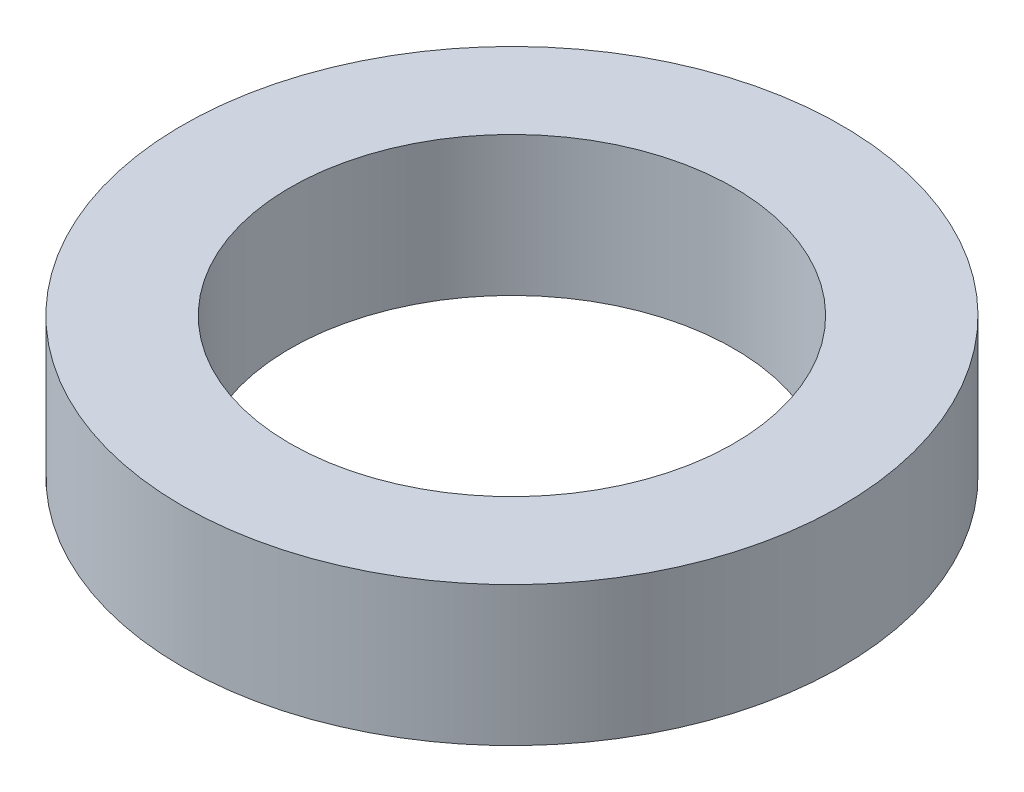
ISO-10303-21;
HEADER;
FILE_DESCRIPTION(('STEP AP214'),'2;1');
FILE_NAME('part.step','',(''),(''),'','','');
FILE_SCHEMA(('AUTOMOTIVE_DESIGN { 1 0 10303 214 1 1 1 1 }'));
ENDSEC;
DATA;
#1=APPLICATION_CONTEXT('core data for automotive mechanical design processes');
#2=APPLICATION_PROTOCOL_DEFINITION('international standard','automotive_design',2000,#1);
#3=PRODUCT_CONTEXT('',#1,'mechanical');
#4=PRODUCT('Part','Part','',(#3));
#5=PRODUCT_RELATED_PRODUCT_CATEGORY('part','',(#4));
#6=PRODUCT_DEFINITION_FORMATION('','',#4);
#7=PRODUCT_DEFINITION_CONTEXT('part definition',#1,'design');
#8=PRODUCT_DEFINITION('design','',#6,#7);
#9=PRODUCT_DEFINITION_SHAPE('','',#8);
#10=(LENGTH_UNIT() NAMED_UNIT(*) SI_UNIT(.MILLI.,.METRE.));
#11=(NAMED_UNIT(*) PLANE_ANGLE_UNIT() SI_UNIT($,.RADIAN.));
#12=(NAMED_UNIT(*) SI_UNIT($,.STERADIAN.) SOLID_ANGLE_UNIT());
#13=UNCERTAINTY_MEASURE_WITH_UNIT(LENGTH_MEASURE(1.E-05),#10,'distance_accuracy_value','');
#14=(GEOMETRIC_REPRESENTATION_CONTEXT(3) GLOBAL_UNCERTAINTY_ASSIGNED_CONTEXT((#13)) GLOBAL_UNIT_ASSIGNED_CONTEXT((#10,
#11,#12)) REPRESENTATION_CONTEXT('',''));
#15=CARTESIAN_POINT('',(0.,0.,0.));
#16=DIRECTION('',(0.,0.,1.));
#17=DIRECTION('',(1.,0.,0.));
#18=AXIS2_PLACEMENT_3D('',#15,#16,#17);
#19=CARTESIAN_POINT('',(0.,11.,0.));
#20=DIRECTION('',(0.,1.,0.));
#21=DIRECTION('',(0.,0.,1.));
#22=AXIS2_PLACEMENT_3D('',#19,#20,#21);
#23=PLANE('',#22);
#24=CARTESIAN_POINT('',(0.,11.,0.));
#25=DIRECTION('',(0.,1.,0.));
#26=DIRECTION('',(0.,0.,1.));
#27=AXIS2_PLACEMENT_3D('',#24,#25,#26);
#28=CIRCLE('',#27,26.);
#29=CARTESIAN_POINT('',(0.,11.,26.));
#30=VERTEX_POINT('',#29);
#31=EDGE_CURVE('E10',#30,#30,#28,.T.);
#32=ORIENTED_EDGE('',*,*,#31,.T.);
#33=EDGE_LOOP('',(#32));
#34=FACE_BOUND('',#33,.T.);
#35=CARTESIAN_POINT('',(0.,11.,0.));
#36=DIRECTION('',(0.,1.,0.));
#37=DIRECTION('',(0.,0.,1.));
#38=AXIS2_PLACEMENT_3D('',#35,#36,#37);
#39=CIRCLE('',#38,17.5);
#40=CARTESIAN_POINT('',(0.,11.,17.5));
#41=VERTEX_POINT('',#40);
#42=EDGE_CURVE('E50',#41,#41,#39,.T.);
#43=ORIENTED_EDGE('',*,*,#42,.F.);
#44=EDGE_LOOP('',(#43));
#45=FACE_BOUND('',#44,.T.);
#46=ADVANCED_FACE('F37',(#34,#45),#23,.T.);
#47=CARTESIAN_POINT('',(0.,0.,0.));
#48=DIRECTION('',(0.,1.,0.));
#49=DIRECTION('',(0.,0.,1.));
#50=AXIS2_PLACEMENT_3D('',#47,#48,#49);
#51=PLANE('',#50);
#52=CARTESIAN_POINT('',(0.,0.,0.));
#53=DIRECTION('',(0.,1.,0.));
#54=DIRECTION('',(0.,0.,1.));
#55=AXIS2_PLACEMENT_3D('',#52,#53,#54);
#56=CIRCLE('',#55,26.);
#57=CARTESIAN_POINT('',(0.,0.,26.));
#58=VERTEX_POINT('',#57);
#59=EDGE_CURVE('E41',#58,#58,#56,.T.);
#60=ORIENTED_EDGE('',*,*,#59,.F.);
#61=EDGE_LOOP('',(#60));
#62=FACE_BOUND('',#61,.T.);
#63=CARTESIAN_POINT('',(0.,0.,0.));
#64=DIRECTION('',(0.,1.,0.));
#65=DIRECTION('',(0.,0.,1.));
#66=AXIS2_PLACEMENT_3D('',#63,#64,#65);
#67=CIRCLE('',#66,17.5);
#68=CARTESIAN_POINT('',(0.,0.,17.5));
#69=VERTEX_POINT('',#68);
#70=EDGE_CURVE('E52',#69,#69,#67,.T.);
#71=ORIENTED_EDGE('',*,*,#70,.T.);
#72=EDGE_LOOP('',(#71));
#73=FACE_BOUND('',#72,.T.);
#74=ADVANCED_FACE('F64',(#62,#73),#51,.F.);
#75=CARTESIAN_POINT('',(0.,11.,0.));
#76=DIRECTION('',(0.,-1.,0.));
#77=DIRECTION('',(0.,0.,-1.));
#78=AXIS2_PLACEMENT_3D('',#75,#76,#77);
#79=CYLINDRICAL_SURFACE('',#78,26.);
#80=ORIENTED_EDGE('',*,*,#31,.F.);
#81=EDGE_LOOP('',(#80));
#82=FACE_BOUND('',#81,.T.);
#83=ORIENTED_EDGE('',*,*,#59,.T.);
#84=EDGE_LOOP('',(#83));
#85=FACE_BOUND('',#84,.T.);
#86=ADVANCED_FACE('F39',(#82,#85),#79,.T.);
#87=CARTESIAN_POINT('',(0.,11.,0.));
#88=DIRECTION('',(0.,-1.,0.));
#89=DIRECTION('',(0.,0.,-1.));
#90=AXIS2_PLACEMENT_3D('',#87,#88,#89);
#91=CYLINDRICAL_SURFACE('',#90,17.5);
#92=ORIENTED_EDGE('',*,*,#42,.T.);
#93=EDGE_LOOP('',(#92));
#94=FACE_BOUND('',#93,.T.);
#95=ORIENTED_EDGE('',*,*,#70,.F.);
#96=EDGE_LOOP('',(#95));
#97=FACE_BOUND('',#96,.T.);
#98=ADVANCED_FACE('F60',(#94,#97),#91,.F.);
#99=CLOSED_SHELL('',(#46,#74,#86,#98));
#100=MANIFOLD_SOLID_BREP('B2',#99);
#101=ADVANCED_BREP_SHAPE_REPRESENTATION('',(#18,#100),#14);
#102=SHAPE_DEFINITION_REPRESENTATION(#9,#101);
ENDSEC;
END-ISO-10303-21;
